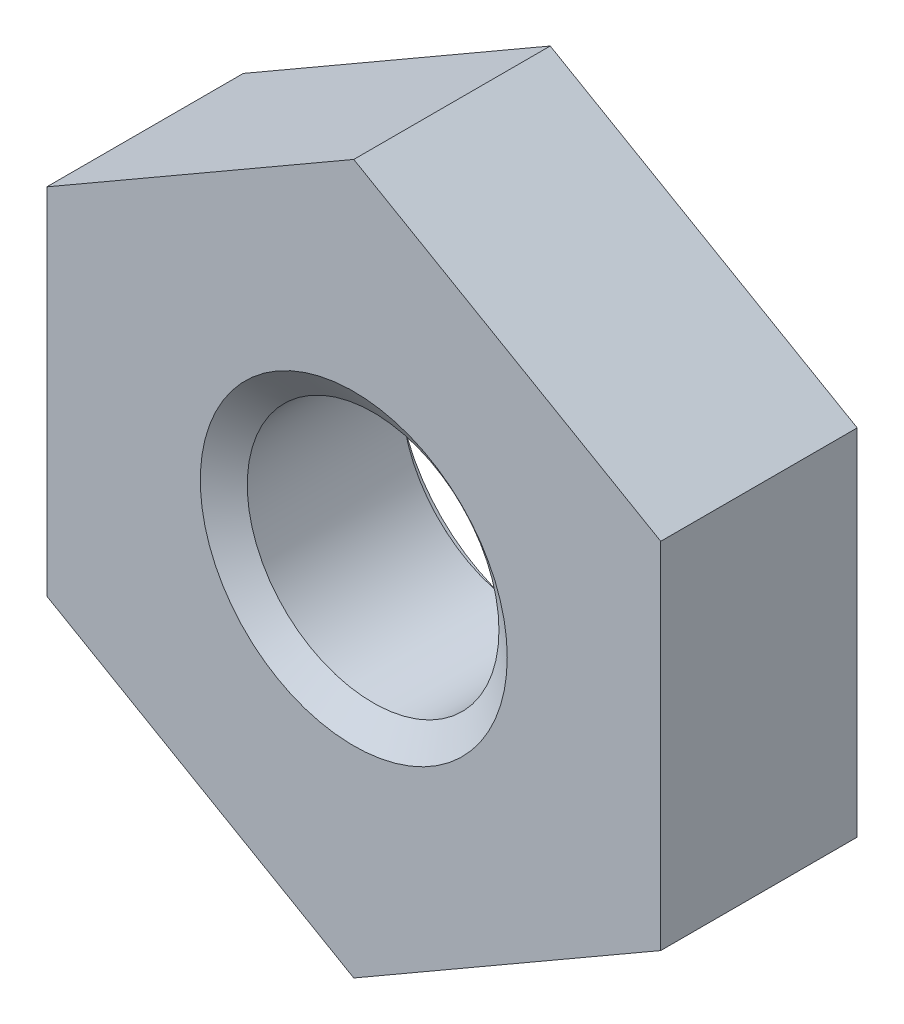
ISO-10303-21;
HEADER;
FILE_DESCRIPTION(('STEP AP214'),'2;1');
FILE_NAME('part.step','',(''),(''),'','','');
FILE_SCHEMA(('AUTOMOTIVE_DESIGN { 1 0 10303 214 1 1 1 1 }'));
ENDSEC;
DATA;
#1=APPLICATION_CONTEXT('core data for automotive mechanical design processes');
#2=APPLICATION_PROTOCOL_DEFINITION('international standard','automotive_design',2000,#1);
#3=PRODUCT_CONTEXT('',#1,'mechanical');
#4=PRODUCT('Part','Part','',(#3));
#5=PRODUCT_RELATED_PRODUCT_CATEGORY('part','',(#4));
#6=PRODUCT_DEFINITION_FORMATION('','',#4);
#7=PRODUCT_DEFINITION_CONTEXT('part definition',#1,'design');
#8=PRODUCT_DEFINITION('design','',#6,#7);
#9=PRODUCT_DEFINITION_SHAPE('','',#8);
#10=(LENGTH_UNIT() NAMED_UNIT(*) SI_UNIT(.MILLI.,.METRE.));
#11=(NAMED_UNIT(*) PLANE_ANGLE_UNIT() SI_UNIT($,.RADIAN.));
#12=(NAMED_UNIT(*) SI_UNIT($,.STERADIAN.) SOLID_ANGLE_UNIT());
#13=UNCERTAINTY_MEASURE_WITH_UNIT(LENGTH_MEASURE(1.E-05),#10,'distance_accuracy_value','');
#14=(GEOMETRIC_REPRESENTATION_CONTEXT(3) GLOBAL_UNCERTAINTY_ASSIGNED_CONTEXT((#13)) GLOBAL_UNIT_ASSIGNED_CONTEXT((#10,
#11,#12)) REPRESENTATION_CONTEXT('',''));
#15=CARTESIAN_POINT('',(0.,0.,0.));
#16=DIRECTION('',(0.,0.,1.));
#17=DIRECTION('',(1.,0.,0.));
#18=AXIS2_PLACEMENT_3D('',#15,#16,#17);
#19=CARTESIAN_POINT('',(0.,0.,-1.6));
#20=DIRECTION('',(0.,0.,1.));
#21=DIRECTION('',(1.,0.,0.));
#22=AXIS2_PLACEMENT_3D('',#19,#20,#21);
#23=CYLINDRICAL_SURFACE('',#22,1.025);
#24=CARTESIAN_POINT('',(0.,0.,-0.157546696097184));
#25=DIRECTION('',(0.,0.,1.));
#26=DIRECTION('',(1.,0.,0.));
#27=AXIS2_PLACEMENT_3D('',#24,#25,#26);
#28=CIRCLE('',#27,1.025);
#29=CARTESIAN_POINT('',(1.025,0.,-0.157546696097184));
#30=VERTEX_POINT('',#29);
#31=EDGE_CURVE('E145',#30,#30,#28,.F.);
#32=ORIENTED_EDGE('',*,*,#31,.F.);
#33=EDGE_LOOP('',(#32));
#34=FACE_BOUND('',#33,.T.);
#35=CARTESIAN_POINT('',(0.,0.,-1.41705330390281));
#36=DIRECTION('',(0.,0.,-1.));
#37=DIRECTION('',(-1.,0.,0.));
#38=AXIS2_PLACEMENT_3D('',#35,#36,#37);
#39=CIRCLE('',#38,1.025);
#40=CARTESIAN_POINT('',(-1.025,0.,-1.41705330390281));
#41=VERTEX_POINT('',#40);
#42=EDGE_CURVE('E50',#41,#41,#39,.F.);
#43=ORIENTED_EDGE('',*,*,#42,.F.);
#44=EDGE_LOOP('',(#43));
#45=FACE_BOUND('',#44,.T.);
#46=ADVANCED_FACE('F43',(#34,#45),#23,.F.);
#47=CARTESIAN_POINT('',(0.,2.88675134594813,-1.6));
#48=DIRECTION('',(-0.500000000000001,0.866025403784438,0.));
#49=DIRECTION('',(-0.866025403784438,-0.500000000000001,0.));
#50=AXIS2_PLACEMENT_3D('',#47,#48,#49);
#51=PLANE('',#50);
#52=DIRECTION('',(-0.866025403784438,-0.500000000000001,0.));
#53=VECTOR('',#52,1.);
#54=CARTESIAN_POINT('',(0.,2.88675134594813,0.));
#55=LINE('',#54,#53);
#56=CARTESIAN_POINT('',(0.,2.88675134594813,0.));
#57=VERTEX_POINT('',#56);
#58=CARTESIAN_POINT('',(-2.5,1.44337567297406,0.));
#59=VERTEX_POINT('',#58);
#60=EDGE_CURVE('E137',#57,#59,#55,.T.);
#61=ORIENTED_EDGE('',*,*,#60,.F.);
#62=DIRECTION('',(0.,0.,1.));
#63=VECTOR('',#62,1.);
#64=CARTESIAN_POINT('',(0.,2.88675134594813,-1.6));
#65=LINE('',#64,#63);
#66=CARTESIAN_POINT('',(0.,2.88675134594813,-1.6));
#67=VERTEX_POINT('',#66);
#68=EDGE_CURVE('E11',#67,#57,#65,.T.);
#69=ORIENTED_EDGE('',*,*,#68,.F.);
#70=DIRECTION('',(-0.866025403784438,-0.500000000000001,0.));
#71=VECTOR('',#70,1.);
#72=CARTESIAN_POINT('',(0.,2.88675134594813,-1.6));
#73=LINE('',#72,#71);
#74=CARTESIAN_POINT('',(-2.5,1.44337567297406,-1.6));
#75=VERTEX_POINT('',#74);
#76=EDGE_CURVE('E157',#67,#75,#73,.T.);
#77=ORIENTED_EDGE('',*,*,#76,.T.);
#78=DIRECTION('',(0.,0.,1.));
#79=VECTOR('',#78,1.);
#80=CARTESIAN_POINT('',(-2.5,1.44337567297406,-1.6));
#81=LINE('',#80,#79);
#82=EDGE_CURVE('E91',#75,#59,#81,.T.);
#83=ORIENTED_EDGE('',*,*,#82,.T.);
#84=EDGE_LOOP('',(#61,#69,#77,#83));
#85=FACE_BOUND('',#84,.T.);
#86=ADVANCED_FACE('F44',(#85),#51,.T.);
#87=CARTESIAN_POINT('',(2.5,1.44337567297406,-1.6));
#88=DIRECTION('',(0.500000000000001,0.866025403784438,0.));
#89=DIRECTION('',(-0.866025403784438,0.500000000000001,0.));
#90=AXIS2_PLACEMENT_3D('',#87,#88,#89);
#91=PLANE('',#90);
#92=DIRECTION('',(-0.866025403784438,0.500000000000001,0.));
#93=VECTOR('',#92,1.);
#94=CARTESIAN_POINT('',(2.5,1.44337567297406,0.));
#95=LINE('',#94,#93);
#96=CARTESIAN_POINT('',(2.5,1.44337567297406,0.));
#97=VERTEX_POINT('',#96);
#98=EDGE_CURVE('E151',#97,#57,#95,.T.);
#99=ORIENTED_EDGE('',*,*,#98,.F.);
#100=DIRECTION('',(0.,0.,1.));
#101=VECTOR('',#100,1.);
#102=CARTESIAN_POINT('',(2.5,1.44337567297406,-1.6));
#103=LINE('',#102,#101);
#104=CARTESIAN_POINT('',(2.5,1.44337567297406,-1.6));
#105=VERTEX_POINT('',#104);
#106=EDGE_CURVE('E53',#105,#97,#103,.T.);
#107=ORIENTED_EDGE('',*,*,#106,.F.);
#108=DIRECTION('',(-0.866025403784438,0.500000000000001,0.));
#109=VECTOR('',#108,1.);
#110=CARTESIAN_POINT('',(2.5,1.44337567297406,-1.6));
#111=LINE('',#110,#109);
#112=EDGE_CURVE('E113',#105,#67,#111,.T.);
#113=ORIENTED_EDGE('',*,*,#112,.T.);
#114=ORIENTED_EDGE('',*,*,#68,.T.);
#115=EDGE_LOOP('',(#99,#107,#113,#114));
#116=FACE_BOUND('',#115,.T.);
#117=ADVANCED_FACE('F197',(#116),#91,.T.);
#118=CARTESIAN_POINT('',(2.5,1.44337567297406,-1.6));
#119=DIRECTION('',(-1.,0.,0.));
#120=DIRECTION('',(0.,0.,1.));
#121=AXIS2_PLACEMENT_3D('',#118,#119,#120);
#122=PLANE('',#121);
#123=DIRECTION('',(0.,-1.,0.));
#124=VECTOR('',#123,1.);
#125=CARTESIAN_POINT('',(2.5,1.44337567297406,0.));
#126=LINE('',#125,#124);
#127=CARTESIAN_POINT('',(2.5,-1.44337567297407,0.));
#128=VERTEX_POINT('',#127);
#129=EDGE_CURVE('E117',#97,#128,#126,.T.);
#130=ORIENTED_EDGE('',*,*,#129,.T.);
#131=DIRECTION('',(0.,0.,1.));
#132=VECTOR('',#131,1.);
#133=CARTESIAN_POINT('',(2.5,-1.44337567297407,-1.6));
#134=LINE('',#133,#132);
#135=CARTESIAN_POINT('',(2.5,-1.44337567297407,-1.6));
#136=VERTEX_POINT('',#135);
#137=EDGE_CURVE('E116',#136,#128,#134,.T.);
#138=ORIENTED_EDGE('',*,*,#137,.F.);
#139=DIRECTION('',(0.,-1.,0.));
#140=VECTOR('',#139,1.);
#141=CARTESIAN_POINT('',(2.5,1.44337567297406,-1.6));
#142=LINE('',#141,#140);
#143=EDGE_CURVE('E106',#105,#136,#142,.T.);
#144=ORIENTED_EDGE('',*,*,#143,.F.);
#145=ORIENTED_EDGE('',*,*,#106,.T.);
#146=EDGE_LOOP('',(#130,#138,#144,#145));
#147=FACE_BOUND('',#146,.T.);
#148=ADVANCED_FACE('F120',(#147),#122,.F.);
#149=CARTESIAN_POINT('',(0.,-2.88675134594813,-1.6));
#150=DIRECTION('',(0.500000000000001,-0.866025403784438,0.));
#151=DIRECTION('',(0.866025403784438,0.500000000000001,0.));
#152=AXIS2_PLACEMENT_3D('',#149,#150,#151);
#153=PLANE('',#152);
#154=DIRECTION('',(0.866025403784438,0.500000000000001,0.));
#155=VECTOR('',#154,1.);
#156=CARTESIAN_POINT('',(0.,-2.88675134594813,0.));
#157=LINE('',#156,#155);
#158=CARTESIAN_POINT('',(0.,-2.88675134594813,0.));
#159=VERTEX_POINT('',#158);
#160=EDGE_CURVE('E149',#159,#128,#157,.T.);
#161=ORIENTED_EDGE('',*,*,#160,.F.);
#162=DIRECTION('',(0.,0.,1.));
#163=VECTOR('',#162,1.);
#164=CARTESIAN_POINT('',(0.,-2.88675134594813,-1.6));
#165=LINE('',#164,#163);
#166=CARTESIAN_POINT('',(0.,-2.88675134594813,-1.6));
#167=VERTEX_POINT('',#166);
#168=EDGE_CURVE('E124',#167,#159,#165,.T.);
#169=ORIENTED_EDGE('',*,*,#168,.F.);
#170=DIRECTION('',(0.866025403784438,0.500000000000001,0.));
#171=VECTOR('',#170,1.);
#172=CARTESIAN_POINT('',(0.,-2.88675134594813,-1.6));
#173=LINE('',#172,#171);
#174=EDGE_CURVE('E111',#167,#136,#173,.T.);
#175=ORIENTED_EDGE('',*,*,#174,.T.);
#176=ORIENTED_EDGE('',*,*,#137,.T.);
#177=EDGE_LOOP('',(#161,#169,#175,#176));
#178=FACE_BOUND('',#177,.T.);
#179=ADVANCED_FACE('F123',(#178),#153,.T.);
#180=CARTESIAN_POINT('',(-2.5,-1.44337567297407,-1.6));
#181=DIRECTION('',(-0.500000000000001,-0.866025403784438,0.));
#182=DIRECTION('',(0.866025403784438,-0.500000000000001,0.));
#183=AXIS2_PLACEMENT_3D('',#180,#181,#182);
#184=PLANE('',#183);
#185=DIRECTION('',(0.866025403784438,-0.500000000000001,0.));
#186=VECTOR('',#185,1.);
#187=CARTESIAN_POINT('',(-2.5,-1.44337567297407,0.));
#188=LINE('',#187,#186);
#189=CARTESIAN_POINT('',(-2.5,-1.44337567297407,0.));
#190=VERTEX_POINT('',#189);
#191=EDGE_CURVE('E146',#190,#159,#188,.T.);
#192=ORIENTED_EDGE('',*,*,#191,.F.);
#193=DIRECTION('',(0.,0.,1.));
#194=VECTOR('',#193,1.);
#195=CARTESIAN_POINT('',(-2.5,-1.44337567297407,-1.6));
#196=LINE('',#195,#194);
#197=CARTESIAN_POINT('',(-2.5,-1.44337567297407,-1.6));
#198=VERTEX_POINT('',#197);
#199=EDGE_CURVE('E165',#198,#190,#196,.T.);
#200=ORIENTED_EDGE('',*,*,#199,.F.);
#201=DIRECTION('',(0.866025403784438,-0.500000000000001,0.));
#202=VECTOR('',#201,1.);
#203=CARTESIAN_POINT('',(-2.5,-1.44337567297407,-1.6));
#204=LINE('',#203,#202);
#205=EDGE_CURVE('E130',#198,#167,#204,.T.);
#206=ORIENTED_EDGE('',*,*,#205,.T.);
#207=ORIENTED_EDGE('',*,*,#168,.T.);
#208=EDGE_LOOP('',(#192,#200,#206,#207));
#209=FACE_BOUND('',#208,.T.);
#210=ADVANCED_FACE('F276',(#209),#184,.T.);
#211=CARTESIAN_POINT('',(-2.5,1.44337567297406,-1.6));
#212=DIRECTION('',(-1.,0.,0.));
#213=DIRECTION('',(0.,0.,1.));
#214=AXIS2_PLACEMENT_3D('',#211,#212,#213);
#215=PLANE('',#214);
#216=DIRECTION('',(0.,-1.,0.));
#217=VECTOR('',#216,1.);
#218=CARTESIAN_POINT('',(-2.5,1.44337567297406,0.));
#219=LINE('',#218,#217);
#220=EDGE_CURVE('E142',#59,#190,#219,.T.);
#221=ORIENTED_EDGE('',*,*,#220,.F.);
#222=ORIENTED_EDGE('',*,*,#82,.F.);
#223=DIRECTION('',(0.,-1.,0.));
#224=VECTOR('',#223,1.);
#225=CARTESIAN_POINT('',(-2.5,1.44337567297406,-1.6));
#226=LINE('',#225,#224);
#227=EDGE_CURVE('E133',#75,#198,#226,.T.);
#228=ORIENTED_EDGE('',*,*,#227,.T.);
#229=ORIENTED_EDGE('',*,*,#199,.T.);
#230=EDGE_LOOP('',(#221,#222,#228,#229));
#231=FACE_BOUND('',#230,.T.);
#232=ADVANCED_FACE('F193',(#231),#215,.T.);
#233=CARTESIAN_POINT('',(0.,2.88675134594813,-1.6));
#234=DIRECTION('',(0.,0.,-1.));
#235=DIRECTION('',(-1.,0.,0.));
#236=AXIS2_PLACEMENT_3D('',#233,#234,#235);
#237=PLANE('',#236);
#238=CARTESIAN_POINT('',(0.,0.,-1.6));
#239=DIRECTION('',(0.,0.,-1.));
#240=DIRECTION('',(-1.,0.,0.));
#241=AXIS2_PLACEMENT_3D('',#238,#239,#240);
#242=CIRCLE('',#241,1.25);
#243=CARTESIAN_POINT('',(-1.25,0.,-1.6));
#244=VERTEX_POINT('',#243);
#245=EDGE_CURVE('E175',#244,#244,#242,.F.);
#246=ORIENTED_EDGE('',*,*,#245,.T.);
#247=EDGE_LOOP('',(#246));
#248=FACE_BOUND('',#247,.T.);
#249=ORIENTED_EDGE('',*,*,#76,.F.);
#250=ORIENTED_EDGE('',*,*,#112,.F.);
#251=ORIENTED_EDGE('',*,*,#143,.T.);
#252=ORIENTED_EDGE('',*,*,#174,.F.);
#253=ORIENTED_EDGE('',*,*,#205,.F.);
#254=ORIENTED_EDGE('',*,*,#227,.F.);
#255=EDGE_LOOP('',(#249,#250,#251,#252,#253,#254));
#256=FACE_BOUND('',#255,.T.);
#257=ADVANCED_FACE('F108',(#248,#256),#237,.T.);
#258=CARTESIAN_POINT('',(0.,2.88675134594813,0.));
#259=DIRECTION('',(0.,0.,-1.));
#260=DIRECTION('',(-1.,0.,0.));
#261=AXIS2_PLACEMENT_3D('',#258,#259,#260);
#262=PLANE('',#261);
#263=CARTESIAN_POINT('',(0.,0.,0.));
#264=DIRECTION('',(0.,0.,1.));
#265=DIRECTION('',(1.,0.,0.));
#266=AXIS2_PLACEMENT_3D('',#263,#264,#265);
#267=CIRCLE('',#266,1.25);
#268=CARTESIAN_POINT('',(1.25,0.,0.));
#269=VERTEX_POINT('',#268);
#270=EDGE_CURVE('E171',#269,#269,#267,.T.);
#271=ORIENTED_EDGE('',*,*,#270,.F.);
#272=EDGE_LOOP('',(#271));
#273=FACE_BOUND('',#272,.T.);
#274=ORIENTED_EDGE('',*,*,#60,.T.);
#275=ORIENTED_EDGE('',*,*,#220,.T.);
#276=ORIENTED_EDGE('',*,*,#191,.T.);
#277=ORIENTED_EDGE('',*,*,#160,.T.);
#278=ORIENTED_EDGE('',*,*,#129,.F.);
#279=ORIENTED_EDGE('',*,*,#98,.T.);
#280=EDGE_LOOP('',(#274,#275,#276,#277,#278,#279));
#281=FACE_BOUND('',#280,.T.);
#282=ADVANCED_FACE('F199',(#273,#281),#262,.F.);
#283=CARTESIAN_POINT('',(0.,0.,-0.173301365706903));
#284=DIRECTION('',(0.,0.,1.));
#285=DIRECTION('',(1.,0.,0.));
#286=AXIS2_PLACEMENT_3D('',#283,#284,#285);
#287=CONICAL_SURFACE('',#286,1.0025,0.959931088596882);
#288=ORIENTED_EDGE('',*,*,#270,.T.);
#289=EDGE_LOOP('',(#288));
#290=FACE_BOUND('',#289,.T.);
#291=ORIENTED_EDGE('',*,*,#31,.T.);
#292=EDGE_LOOP('',(#291));
#293=FACE_BOUND('',#292,.T.);
#294=ADVANCED_FACE('F218',(#290,#293),#287,.F.);
#295=CARTESIAN_POINT('',(0.,0.,-1.5746));
#296=DIRECTION('',(0.,0.,-1.));
#297=DIRECTION('',(-1.,0.,0.));
#298=AXIS2_PLACEMENT_3D('',#295,#296,#297);
#299=CONICAL_SURFACE('',#298,1.25,0.959931088596882);
#300=CARTESIAN_POINT('',(0.,0.,-1.5746));
#301=DIRECTION('',(0.,0.,1.));
#302=DIRECTION('',(1.,0.,0.));
#303=AXIS2_PLACEMENT_3D('',#300,#301,#302);
#304=CIRCLE('',#303,1.25);
#305=CARTESIAN_POINT('',(1.25,0.,-1.5746));
#306=VERTEX_POINT('',#305);
#307=EDGE_CURVE('E174',#306,#306,#304,.T.);
#308=ORIENTED_EDGE('',*,*,#307,.F.);
#309=EDGE_LOOP('',(#308));
#310=FACE_BOUND('',#309,.T.);
#311=ORIENTED_EDGE('',*,*,#42,.T.);
#312=EDGE_LOOP('',(#311));
#313=FACE_BOUND('',#312,.T.);
#314=ADVANCED_FACE('F225',(#310,#313),#299,.F.);
#315=CARTESIAN_POINT('',(0.,0.,-25.0375057290932));
#316=DIRECTION('',(0.,0.,1.));
#317=DIRECTION('',(1.,0.,0.));
#318=AXIS2_PLACEMENT_3D('',#315,#316,#317);
#319=CYLINDRICAL_SURFACE('',#318,1.25);
#320=ORIENTED_EDGE('',*,*,#245,.F.);
#321=EDGE_LOOP('',(#320));
#322=FACE_BOUND('',#321,.T.);
#323=ORIENTED_EDGE('',*,*,#307,.T.);
#324=EDGE_LOOP('',(#323));
#325=FACE_BOUND('',#324,.T.);
#326=ADVANCED_FACE('F233',(#322,#325),#319,.F.);
#327=CLOSED_SHELL('',(#46,#86,#117,#148,#179,#210,#232,#257,#282,#294,#314,#326));
#328=MANIFOLD_SOLID_BREP('B2',#327);
#329=ADVANCED_BREP_SHAPE_REPRESENTATION('',(#18,#328),#14);
#330=SHAPE_DEFINITION_REPRESENTATION(#9,#329);
ENDSEC;
END-ISO-10303-21;
